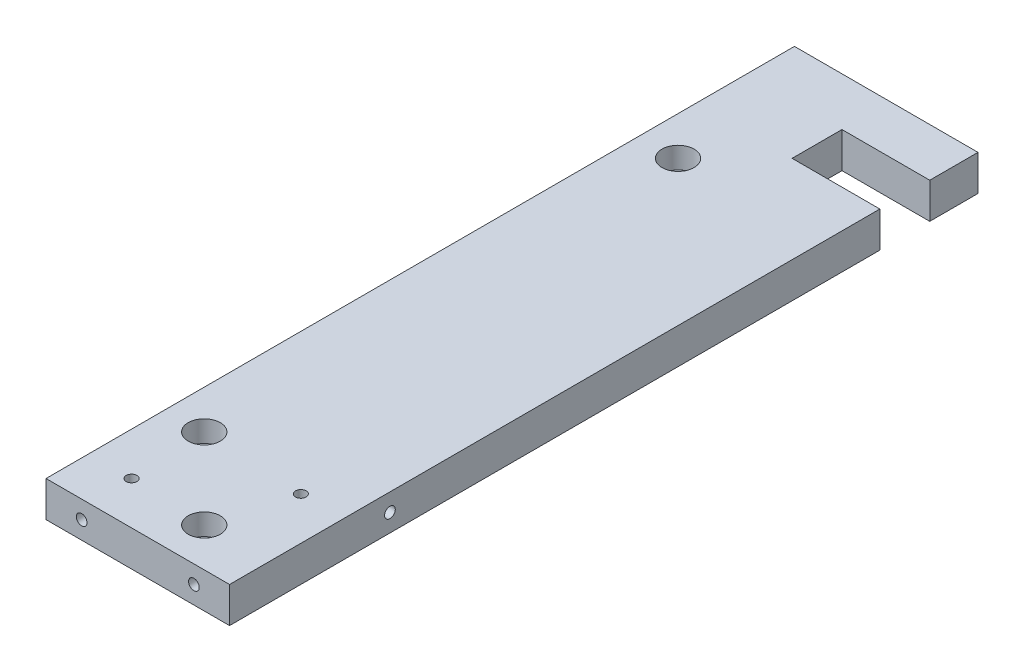
ISO-10303-21;
HEADER;
FILE_DESCRIPTION(('STEP AP214'),'2;1');
FILE_NAME('part.step','',(''),(''),'','','');
FILE_SCHEMA(('AUTOMOTIVE_DESIGN { 1 0 10303 214 1 1 1 1 }'));
ENDSEC;
DATA;
#1=APPLICATION_CONTEXT('core data for automotive mechanical design processes');
#2=APPLICATION_PROTOCOL_DEFINITION('international standard','automotive_design',2000,#1);
#3=PRODUCT_CONTEXT('',#1,'mechanical');
#4=PRODUCT('Part','Part','',(#3));
#5=PRODUCT_RELATED_PRODUCT_CATEGORY('part','',(#4));
#6=PRODUCT_DEFINITION_FORMATION('','',#4);
#7=PRODUCT_DEFINITION_CONTEXT('part definition',#1,'design');
#8=PRODUCT_DEFINITION('design','',#6,#7);
#9=PRODUCT_DEFINITION_SHAPE('','',#8);
#10=(LENGTH_UNIT() NAMED_UNIT(*) SI_UNIT(.MILLI.,.METRE.));
#11=(NAMED_UNIT(*) PLANE_ANGLE_UNIT() SI_UNIT($,.RADIAN.));
#12=(NAMED_UNIT(*) SI_UNIT($,.STERADIAN.) SOLID_ANGLE_UNIT());
#13=UNCERTAINTY_MEASURE_WITH_UNIT(LENGTH_MEASURE(1.E-05),#10,'distance_accuracy_value','');
#14=(GEOMETRIC_REPRESENTATION_CONTEXT(3) GLOBAL_UNCERTAINTY_ASSIGNED_CONTEXT((#13)) GLOBAL_UNIT_ASSIGNED_CONTEXT((#10,
#11,#12)) REPRESENTATION_CONTEXT('',''));
#15=CARTESIAN_POINT('',(0.,0.,0.));
#16=DIRECTION('',(0.,0.,1.));
#17=DIRECTION('',(1.,0.,0.));
#18=AXIS2_PLACEMENT_3D('',#15,#16,#17);
#19=CARTESIAN_POINT('',(-20.3137084989848,5.,-16.7637084989848));
#20=DIRECTION('',(0.,-1.,0.));
#21=DIRECTION('',(0.,0.,-1.));
#22=AXIS2_PLACEMENT_3D('',#19,#20,#21);
#23=CYLINDRICAL_SURFACE('',#22,1.5);
#24=CARTESIAN_POINT('',(-20.3137084989848,0.,-16.7637084989848));
#25=DIRECTION('',(0.,1.,0.));
#26=DIRECTION('',(0.,0.,1.));
#27=AXIS2_PLACEMENT_3D('',#24,#25,#26);
#28=CIRCLE('',#27,1.5);
#29=CARTESIAN_POINT('',(-20.3137084989848,0.,-15.2637084989848));
#30=VERTEX_POINT('',#29);
#31=EDGE_CURVE('E223',#30,#30,#28,.T.);
#32=ORIENTED_EDGE('',*,*,#31,.F.);
#33=EDGE_LOOP('',(#32));
#34=FACE_BOUND('',#33,.T.);
#35=CARTESIAN_POINT('',(-20.3137084989848,2.,-16.7637084989848));
#36=DIRECTION('',(0.,1.,0.));
#37=DIRECTION('',(0.,0.,1.));
#38=AXIS2_PLACEMENT_3D('',#35,#36,#37);
#39=CIRCLE('',#38,1.5);
#40=CARTESIAN_POINT('',(-20.3137084989848,2.,-15.2637084989848));
#41=VERTEX_POINT('',#40);
#42=EDGE_CURVE('E124',#41,#41,#39,.T.);
#43=ORIENTED_EDGE('',*,*,#42,.T.);
#44=EDGE_LOOP('',(#43));
#45=FACE_BOUND('',#44,.T.);
#46=ADVANCED_FACE('F120',(#34,#45),#23,.F.);
#47=CARTESIAN_POINT('',(-9.,5.,-5.45));
#48=DIRECTION('',(0.,-1.,0.));
#49=DIRECTION('',(0.,0.,-1.));
#50=AXIS2_PLACEMENT_3D('',#47,#48,#49);
#51=CYLINDRICAL_SURFACE('',#50,1.5);
#52=CARTESIAN_POINT('',(-9.,0.,-5.45));
#53=DIRECTION('',(0.,1.,0.));
#54=DIRECTION('',(0.,0.,1.));
#55=AXIS2_PLACEMENT_3D('',#52,#53,#54);
#56=CIRCLE('',#55,1.5);
#57=CARTESIAN_POINT('',(-9.,0.,-3.95));
#58=VERTEX_POINT('',#57);
#59=EDGE_CURVE('E260',#58,#58,#56,.T.);
#60=ORIENTED_EDGE('',*,*,#59,.F.);
#61=EDGE_LOOP('',(#60));
#62=FACE_BOUND('',#61,.T.);
#63=CARTESIAN_POINT('',(-9.,2.,-5.45));
#64=DIRECTION('',(0.,1.,0.));
#65=DIRECTION('',(0.,0.,1.));
#66=AXIS2_PLACEMENT_3D('',#63,#64,#65);
#67=CIRCLE('',#66,1.5);
#68=CARTESIAN_POINT('',(-9.,2.,-3.95));
#69=VERTEX_POINT('',#68);
#70=EDGE_CURVE('E250',#69,#69,#67,.T.);
#71=ORIENTED_EDGE('',*,*,#70,.T.);
#72=EDGE_LOOP('',(#71));
#73=FACE_BOUND('',#72,.T.);
#74=ADVANCED_FACE('F299',(#62,#73),#51,.F.);
#75=CARTESIAN_POINT('',(-20.3137084989848,5.,-83.2317459305205));
#76=DIRECTION('',(0.,-1.,0.));
#77=DIRECTION('',(0.,0.,-1.));
#78=AXIS2_PLACEMENT_3D('',#75,#76,#77);
#79=CYLINDRICAL_SURFACE('',#78,1.5);
#80=CARTESIAN_POINT('',(-20.3137084989848,0.,-83.2317459305205));
#81=DIRECTION('',(0.,1.,0.));
#82=DIRECTION('',(0.,0.,1.));
#83=AXIS2_PLACEMENT_3D('',#80,#81,#82);
#84=CIRCLE('',#83,1.5);
#85=CARTESIAN_POINT('',(-20.3137084989848,0.,-81.7317459305205));
#86=VERTEX_POINT('',#85);
#87=EDGE_CURVE('E256',#86,#86,#84,.T.);
#88=ORIENTED_EDGE('',*,*,#87,.F.);
#89=EDGE_LOOP('',(#88));
#90=FACE_BOUND('',#89,.T.);
#91=CARTESIAN_POINT('',(-20.3137084989848,2.,-83.2317459305205));
#92=DIRECTION('',(0.,1.,0.));
#93=DIRECTION('',(0.,0.,1.));
#94=AXIS2_PLACEMENT_3D('',#91,#92,#93);
#95=CIRCLE('',#94,1.5);
#96=CARTESIAN_POINT('',(-20.3137084989848,2.,-81.7317459305205));
#97=VERTEX_POINT('',#96);
#98=EDGE_CURVE('E248',#97,#97,#95,.T.);
#99=ORIENTED_EDGE('',*,*,#98,.T.);
#100=EDGE_LOOP('',(#99));
#101=FACE_BOUND('',#100,.T.);
#102=ADVANCED_FACE('F305',(#90,#101),#79,.F.);
#103=CARTESIAN_POINT('',(0.,5.,-98.2317459305205));
#104=DIRECTION('',(0.,0.,1.));
#105=DIRECTION('',(1.,0.,0.));
#106=AXIS2_PLACEMENT_3D('',#103,#104,#105);
#107=PLANE('',#106);
#108=DIRECTION('',(-1.,0.,0.));
#109=VECTOR('',#108,1.);
#110=CARTESIAN_POINT('',(0.,0.,-98.2317459305205));
#111=LINE('',#110,#109);
#112=CARTESIAN_POINT('',(0.,0.,-98.2317459305205));
#113=VERTEX_POINT('',#112);
#114=CARTESIAN_POINT('',(-12.3137084989848,0.,-98.2317459305205));
#115=VERTEX_POINT('',#114);
#116=EDGE_CURVE('E222',#113,#115,#111,.T.);
#117=ORIENTED_EDGE('',*,*,#116,.F.);
#118=DIRECTION('',(0.,-1.,0.));
#119=VECTOR('',#118,1.);
#120=CARTESIAN_POINT('',(0.,5.,-98.2317459305205));
#121=LINE('',#120,#119);
#122=CARTESIAN_POINT('',(0.,5.,-98.2317459305205));
#123=VERTEX_POINT('',#122);
#124=EDGE_CURVE('E130',#123,#113,#121,.T.);
#125=ORIENTED_EDGE('',*,*,#124,.F.);
#126=DIRECTION('',(-1.,0.,0.));
#127=VECTOR('',#126,1.);
#128=CARTESIAN_POINT('',(0.,5.,-98.2317459305205));
#129=LINE('',#128,#127);
#130=CARTESIAN_POINT('',(-12.3137084989848,5.,-98.2317459305205));
#131=VERTEX_POINT('',#130);
#132=EDGE_CURVE('E271',#123,#131,#129,.T.);
#133=ORIENTED_EDGE('',*,*,#132,.T.);
#134=DIRECTION('',(0.,-1.,0.));
#135=VECTOR('',#134,1.);
#136=CARTESIAN_POINT('',(-12.3137084989848,5.,-98.2317459305205));
#137=LINE('',#136,#135);
#138=EDGE_CURVE('E13',#131,#115,#137,.T.);
#139=ORIENTED_EDGE('',*,*,#138,.T.);
#140=EDGE_LOOP('',(#117,#125,#133,#139));
#141=FACE_BOUND('',#140,.T.);
#142=ADVANCED_FACE('F311',(#141),#107,.T.);
#143=CARTESIAN_POINT('',(0.,5.,0.));
#144=DIRECTION('',(-1.,0.,0.));
#145=DIRECTION('',(0.,0.,1.));
#146=AXIS2_PLACEMENT_3D('',#143,#144,#145);
#147=PLANE('',#146);
#148=DIRECTION('',(0.,0.,-1.));
#149=VECTOR('',#148,1.);
#150=CARTESIAN_POINT('',(0.,0.,0.));
#151=LINE('',#150,#149);
#152=CARTESIAN_POINT('',(0.,0.,-105.));
#153=VERTEX_POINT('',#152);
#154=EDGE_CURVE('E226',#113,#153,#151,.T.);
#155=ORIENTED_EDGE('',*,*,#154,.T.);
#156=DIRECTION('',(0.,-1.,0.));
#157=VECTOR('',#156,1.);
#158=CARTESIAN_POINT('',(0.,5.,-105.));
#159=LINE('',#158,#157);
#160=CARTESIAN_POINT('',(0.,5.,-105.));
#161=VERTEX_POINT('',#160);
#162=EDGE_CURVE('E244',#161,#153,#159,.T.);
#163=ORIENTED_EDGE('',*,*,#162,.F.);
#164=DIRECTION('',(0.,0.,-1.));
#165=VECTOR('',#164,1.);
#166=CARTESIAN_POINT('',(0.,5.,0.));
#167=LINE('',#166,#165);
#168=EDGE_CURVE('E209',#123,#161,#167,.T.);
#169=ORIENTED_EDGE('',*,*,#168,.F.);
#170=ORIENTED_EDGE('',*,*,#124,.T.);
#171=EDGE_LOOP('',(#155,#163,#169,#170));
#172=FACE_BOUND('',#171,.T.);
#173=ADVANCED_FACE('F514',(#172),#147,.F.);
#174=CARTESIAN_POINT('',(0.,5.,-105.));
#175=DIRECTION('',(0.,0.,1.));
#176=DIRECTION('',(1.,0.,0.));
#177=AXIS2_PLACEMENT_3D('',#174,#175,#176);
#178=PLANE('',#177);
#179=DIRECTION('',(-1.,0.,0.));
#180=VECTOR('',#179,1.);
#181=CARTESIAN_POINT('',(0.,0.,-105.));
#182=LINE('',#181,#180);
#183=CARTESIAN_POINT('',(-25.75,0.,-105.));
#184=VERTEX_POINT('',#183);
#185=EDGE_CURVE('E229',#153,#184,#182,.T.);
#186=ORIENTED_EDGE('',*,*,#185,.T.);
#187=DIRECTION('',(0.,-1.,0.));
#188=VECTOR('',#187,1.);
#189=CARTESIAN_POINT('',(-25.75,5.,-105.));
#190=LINE('',#189,#188);
#191=CARTESIAN_POINT('',(-25.75,5.,-105.));
#192=VERTEX_POINT('',#191);
#193=EDGE_CURVE('E242',#192,#184,#190,.T.);
#194=ORIENTED_EDGE('',*,*,#193,.F.);
#195=DIRECTION('',(-1.,0.,0.));
#196=VECTOR('',#195,1.);
#197=CARTESIAN_POINT('',(0.,5.,-105.));
#198=LINE('',#197,#196);
#199=EDGE_CURVE('E215',#161,#192,#198,.T.);
#200=ORIENTED_EDGE('',*,*,#199,.F.);
#201=ORIENTED_EDGE('',*,*,#162,.T.);
#202=EDGE_LOOP('',(#186,#194,#200,#201));
#203=FACE_BOUND('',#202,.T.);
#204=ADVANCED_FACE('F279',(#203),#178,.F.);
#205=CARTESIAN_POINT('',(-25.75,5.,0.));
#206=DIRECTION('',(-1.,0.,0.));
#207=DIRECTION('',(0.,0.,1.));
#208=AXIS2_PLACEMENT_3D('',#205,#206,#207);
#209=PLANE('',#208);
#210=CARTESIAN_POINT('',(-25.75,2.5,-10.));
#211=DIRECTION('',(-1.,0.,0.));
#212=DIRECTION('',(0.,0.,1.));
#213=AXIS2_PLACEMENT_3D('',#210,#211,#212);
#214=CIRCLE('',#213,0.75);
#215=CARTESIAN_POINT('',(-25.75,2.5,-9.25));
#216=VERTEX_POINT('',#215);
#217=EDGE_CURVE('E414',#216,#216,#214,.T.);
#218=ORIENTED_EDGE('',*,*,#217,.F.);
#219=EDGE_LOOP('',(#218));
#220=FACE_BOUND('',#219,.T.);
#221=CARTESIAN_POINT('',(-25.75,2.5,-30.));
#222=DIRECTION('',(-1.,0.,0.));
#223=DIRECTION('',(0.,0.,1.));
#224=AXIS2_PLACEMENT_3D('',#221,#222,#223);
#225=CIRCLE('',#224,0.749999999999998);
#226=CARTESIAN_POINT('',(-25.75,2.5,-29.25));
#227=VERTEX_POINT('',#226);
#228=EDGE_CURVE('E420',#227,#227,#225,.T.);
#229=ORIENTED_EDGE('',*,*,#228,.F.);
#230=EDGE_LOOP('',(#229));
#231=FACE_BOUND('',#230,.T.);
#232=CARTESIAN_POINT('',(-25.75,2.5,-50.));
#233=DIRECTION('',(-1.,0.,0.));
#234=DIRECTION('',(0.,0.,1.));
#235=AXIS2_PLACEMENT_3D('',#232,#233,#234);
#236=CIRCLE('',#235,0.749999999999999);
#237=CARTESIAN_POINT('',(-25.75,2.5,-49.25));
#238=VERTEX_POINT('',#237);
#239=EDGE_CURVE('E428',#238,#238,#236,.T.);
#240=ORIENTED_EDGE('',*,*,#239,.F.);
#241=EDGE_LOOP('',(#240));
#242=FACE_BOUND('',#241,.T.);
#243=CARTESIAN_POINT('',(-25.75,2.5,-70.));
#244=DIRECTION('',(-1.,0.,0.));
#245=DIRECTION('',(0.,0.,1.));
#246=AXIS2_PLACEMENT_3D('',#243,#244,#245);
#247=CIRCLE('',#246,0.749999999999999);
#248=CARTESIAN_POINT('',(-25.75,2.5,-69.25));
#249=VERTEX_POINT('',#248);
#250=EDGE_CURVE('E434',#249,#249,#247,.T.);
#251=ORIENTED_EDGE('',*,*,#250,.F.);
#252=EDGE_LOOP('',(#251));
#253=FACE_BOUND('',#252,.T.);
#254=CARTESIAN_POINT('',(-25.75,2.5,-90.));
#255=DIRECTION('',(-1.,0.,0.));
#256=DIRECTION('',(0.,0.,1.));
#257=AXIS2_PLACEMENT_3D('',#254,#255,#256);
#258=CIRCLE('',#257,0.749999999999999);
#259=CARTESIAN_POINT('',(-25.75,2.5,-89.25));
#260=VERTEX_POINT('',#259);
#261=EDGE_CURVE('E440',#260,#260,#258,.T.);
#262=ORIENTED_EDGE('',*,*,#261,.F.);
#263=EDGE_LOOP('',(#262));
#264=FACE_BOUND('',#263,.T.);
#265=DIRECTION('',(0.,0.,-1.));
#266=VECTOR('',#265,1.);
#267=CARTESIAN_POINT('',(-25.75,0.,0.));
#268=LINE('',#267,#266);
#269=CARTESIAN_POINT('',(-25.75,0.,0.));
#270=VERTEX_POINT('',#269);
#271=EDGE_CURVE('E233',#270,#184,#268,.T.);
#272=ORIENTED_EDGE('',*,*,#271,.F.);
#273=DIRECTION('',(0.,-1.,0.));
#274=VECTOR('',#273,1.);
#275=CARTESIAN_POINT('',(-25.75,5.,0.));
#276=LINE('',#275,#274);
#277=CARTESIAN_POINT('',(-25.75,5.,0.));
#278=VERTEX_POINT('',#277);
#279=EDGE_CURVE('E202',#278,#270,#276,.T.);
#280=ORIENTED_EDGE('',*,*,#279,.F.);
#281=DIRECTION('',(0.,0.,-1.));
#282=VECTOR('',#281,1.);
#283=CARTESIAN_POINT('',(-25.75,5.,0.));
#284=LINE('',#283,#282);
#285=EDGE_CURVE('E213',#278,#192,#284,.T.);
#286=ORIENTED_EDGE('',*,*,#285,.T.);
#287=ORIENTED_EDGE('',*,*,#193,.T.);
#288=EDGE_LOOP('',(#272,#280,#286,#287));
#289=FACE_BOUND('',#288,.T.);
#290=ADVANCED_FACE('F282',(#220,#231,#242,#253,#264,#289),#209,.T.);
#291=CARTESIAN_POINT('',(0.,5.,0.));
#292=DIRECTION('',(0.,0.,1.));
#293=DIRECTION('',(1.,0.,0.));
#294=AXIS2_PLACEMENT_3D('',#291,#292,#293);
#295=PLANE('',#294);
#296=CARTESIAN_POINT('',(-20.75,2.5,0.));
#297=DIRECTION('',(0.,0.,1.));
#298=DIRECTION('',(1.,0.,0.));
#299=AXIS2_PLACEMENT_3D('',#296,#297,#298);
#300=CIRCLE('',#299,0.750000000000002);
#301=CARTESIAN_POINT('',(-20.,2.5,0.));
#302=VERTEX_POINT('',#301);
#303=EDGE_CURVE('E464',#302,#302,#300,.T.);
#304=ORIENTED_EDGE('',*,*,#303,.F.);
#305=EDGE_LOOP('',(#304));
#306=FACE_BOUND('',#305,.T.);
#307=CARTESIAN_POINT('',(-5.,2.5,0.));
#308=DIRECTION('',(0.,0.,1.));
#309=DIRECTION('',(1.,0.,0.));
#310=AXIS2_PLACEMENT_3D('',#307,#308,#309);
#311=CIRCLE('',#310,0.749999999999999);
#312=CARTESIAN_POINT('',(-4.25,2.5,0.));
#313=VERTEX_POINT('',#312);
#314=EDGE_CURVE('E467',#313,#313,#311,.T.);
#315=ORIENTED_EDGE('',*,*,#314,.F.);
#316=EDGE_LOOP('',(#315));
#317=FACE_BOUND('',#316,.T.);
#318=DIRECTION('',(-1.,0.,0.));
#319=VECTOR('',#318,1.);
#320=CARTESIAN_POINT('',(0.,0.,0.));
#321=LINE('',#320,#319);
#322=CARTESIAN_POINT('',(0.,0.,0.));
#323=VERTEX_POINT('',#322);
#324=EDGE_CURVE('E199',#323,#270,#321,.T.);
#325=ORIENTED_EDGE('',*,*,#324,.F.);
#326=DIRECTION('',(0.,-1.,0.));
#327=VECTOR('',#326,1.);
#328=CARTESIAN_POINT('',(0.,5.,0.));
#329=LINE('',#328,#327);
#330=CARTESIAN_POINT('',(0.,5.,0.));
#331=VERTEX_POINT('',#330);
#332=EDGE_CURVE('E193',#331,#323,#329,.T.);
#333=ORIENTED_EDGE('',*,*,#332,.F.);
#334=DIRECTION('',(-1.,0.,0.));
#335=VECTOR('',#334,1.);
#336=CARTESIAN_POINT('',(0.,5.,0.));
#337=LINE('',#336,#335);
#338=EDGE_CURVE('E197',#331,#278,#337,.T.);
#339=ORIENTED_EDGE('',*,*,#338,.T.);
#340=ORIENTED_EDGE('',*,*,#279,.T.);
#341=EDGE_LOOP('',(#325,#333,#339,#340));
#342=FACE_BOUND('',#341,.T.);
#343=ADVANCED_FACE('F195',(#306,#317,#342),#295,.T.);
#344=CARTESIAN_POINT('',(0.,2.5,-22.5));
#345=DIRECTION('',(1.,0.,0.));
#346=DIRECTION('',(0.,0.,-1.));
#347=AXIS2_PLACEMENT_3D('',#344,#345,#346);
#348=CIRCLE('',#347,0.750000000000002);
#349=CARTESIAN_POINT('',(0.,2.5,-23.25));
#350=VERTEX_POINT('',#349);
#351=EDGE_CURVE('E448',#350,#350,#348,.T.);
#352=ORIENTED_EDGE('',*,*,#351,.F.);
#353=EDGE_LOOP('',(#352));
#354=FACE_BOUND('',#353,.T.);
#355=CARTESIAN_POINT('',(0.,0.,-91.2317459305205));
#356=VERTEX_POINT('',#355);
#357=EDGE_CURVE('E230',#323,#356,#151,.T.);
#358=ORIENTED_EDGE('',*,*,#357,.T.);
#359=DIRECTION('',(0.,-1.,0.));
#360=VECTOR('',#359,1.);
#361=CARTESIAN_POINT('',(0.,5.,-91.2317459305205));
#362=LINE('',#361,#360);
#363=CARTESIAN_POINT('',(0.,5.,-91.2317459305205));
#364=VERTEX_POINT('',#363);
#365=EDGE_CURVE('E203',#364,#356,#362,.T.);
#366=ORIENTED_EDGE('',*,*,#365,.F.);
#367=EDGE_CURVE('E206',#331,#364,#167,.T.);
#368=ORIENTED_EDGE('',*,*,#367,.F.);
#369=ORIENTED_EDGE('',*,*,#332,.T.);
#370=EDGE_LOOP('',(#358,#366,#368,#369));
#371=FACE_BOUND('',#370,.T.);
#372=ADVANCED_FACE('F207',(#354,#371),#147,.F.);
#373=CARTESIAN_POINT('',(0.,5.,-91.2317459305205));
#374=DIRECTION('',(0.,0.,1.));
#375=DIRECTION('',(1.,0.,0.));
#376=AXIS2_PLACEMENT_3D('',#373,#374,#375);
#377=PLANE('',#376);
#378=DIRECTION('',(-1.,0.,0.));
#379=VECTOR('',#378,1.);
#380=CARTESIAN_POINT('',(0.,0.,-91.2317459305205));
#381=LINE('',#380,#379);
#382=CARTESIAN_POINT('',(-12.3137084989848,0.,-91.2317459305205));
#383=VERTEX_POINT('',#382);
#384=EDGE_CURVE('E167',#356,#383,#381,.T.);
#385=ORIENTED_EDGE('',*,*,#384,.T.);
#386=DIRECTION('',(0.,-1.,0.));
#387=VECTOR('',#386,1.);
#388=CARTESIAN_POINT('',(-12.3137084989848,5.,-91.2317459305205));
#389=LINE('',#388,#387);
#390=CARTESIAN_POINT('',(-12.3137084989848,5.,-91.2317459305205));
#391=VERTEX_POINT('',#390);
#392=EDGE_CURVE('E174',#391,#383,#389,.T.);
#393=ORIENTED_EDGE('',*,*,#392,.F.);
#394=DIRECTION('',(-1.,0.,0.));
#395=VECTOR('',#394,1.);
#396=CARTESIAN_POINT('',(0.,5.,-91.2317459305205));
#397=LINE('',#396,#395);
#398=EDGE_CURVE('E139',#364,#391,#397,.T.);
#399=ORIENTED_EDGE('',*,*,#398,.F.);
#400=ORIENTED_EDGE('',*,*,#365,.T.);
#401=EDGE_LOOP('',(#385,#393,#399,#400));
#402=FACE_BOUND('',#401,.T.);
#403=ADVANCED_FACE('F294',(#402),#377,.F.);
#404=CARTESIAN_POINT('',(-12.3137084989848,5.,0.));
#405=DIRECTION('',(1.,0.,0.));
#406=DIRECTION('',(0.,0.,-1.));
#407=AXIS2_PLACEMENT_3D('',#404,#405,#406);
#408=PLANE('',#407);
#409=DIRECTION('',(0.,0.,1.));
#410=VECTOR('',#409,1.);
#411=CARTESIAN_POINT('',(-12.3137084989848,0.,0.));
#412=LINE('',#411,#410);
#413=EDGE_CURVE('E220',#115,#383,#412,.T.);
#414=ORIENTED_EDGE('',*,*,#413,.F.);
#415=ORIENTED_EDGE('',*,*,#138,.F.);
#416=DIRECTION('',(0.,0.,1.));
#417=VECTOR('',#416,1.);
#418=CARTESIAN_POINT('',(-12.3137084989848,5.,0.));
#419=LINE('',#418,#417);
#420=EDGE_CURVE('E238',#131,#391,#419,.T.);
#421=ORIENTED_EDGE('',*,*,#420,.T.);
#422=ORIENTED_EDGE('',*,*,#392,.T.);
#423=EDGE_LOOP('',(#414,#415,#421,#422));
#424=FACE_BOUND('',#423,.T.);
#425=ADVANCED_FACE('F122',(#424),#408,.T.);
#426=CARTESIAN_POINT('',(0.,0.,0.));
#427=DIRECTION('',(0.,1.,0.));
#428=DIRECTION('',(0.,0.,1.));
#429=AXIS2_PLACEMENT_3D('',#426,#427,#428);
#430=PLANE('',#429);
#431=CARTESIAN_POINT('',(-19.75,0.,-6.));
#432=DIRECTION('',(0.,1.,0.));
#433=DIRECTION('',(0.,0.,1.));
#434=AXIS2_PLACEMENT_3D('',#431,#432,#433);
#435=CIRCLE('',#434,0.750000000000002);
#436=CARTESIAN_POINT('',(-19.75,0.,-5.25));
#437=VERTEX_POINT('',#436);
#438=EDGE_CURVE('E446',#437,#437,#435,.T.);
#439=ORIENTED_EDGE('',*,*,#438,.T.);
#440=EDGE_LOOP('',(#439));
#441=FACE_BOUND('',#440,.T.);
#442=CARTESIAN_POINT('',(-6.,0.,-16.));
#443=DIRECTION('',(0.,1.,0.));
#444=DIRECTION('',(0.,0.,1.));
#445=AXIS2_PLACEMENT_3D('',#442,#443,#444);
#446=CIRCLE('',#445,0.75);
#447=CARTESIAN_POINT('',(-6.,0.,-15.25));
#448=VERTEX_POINT('',#447);
#449=EDGE_CURVE('E413',#448,#448,#446,.T.);
#450=ORIENTED_EDGE('',*,*,#449,.T.);
#451=EDGE_LOOP('',(#450));
#452=FACE_BOUND('',#451,.T.);
#453=ORIENTED_EDGE('',*,*,#87,.T.);
#454=EDGE_LOOP('',(#453));
#455=FACE_BOUND('',#454,.T.);
#456=ORIENTED_EDGE('',*,*,#59,.T.);
#457=EDGE_LOOP('',(#456));
#458=FACE_BOUND('',#457,.T.);
#459=ORIENTED_EDGE('',*,*,#31,.T.);
#460=EDGE_LOOP('',(#459));
#461=FACE_BOUND('',#460,.T.);
#462=ORIENTED_EDGE('',*,*,#413,.T.);
#463=ORIENTED_EDGE('',*,*,#384,.F.);
#464=ORIENTED_EDGE('',*,*,#357,.F.);
#465=ORIENTED_EDGE('',*,*,#324,.T.);
#466=ORIENTED_EDGE('',*,*,#271,.T.);
#467=ORIENTED_EDGE('',*,*,#185,.F.);
#468=ORIENTED_EDGE('',*,*,#154,.F.);
#469=ORIENTED_EDGE('',*,*,#116,.T.);
#470=EDGE_LOOP('',(#462,#463,#464,#465,#466,#467,#468,#469));
#471=FACE_BOUND('',#470,.T.);
#472=ADVANCED_FACE('F283',(#441,#452,#455,#458,#461,#471),#430,.F.);
#473=CARTESIAN_POINT('',(0.,5.,0.));
#474=DIRECTION('',(0.,1.,0.));
#475=DIRECTION('',(0.,0.,1.));
#476=AXIS2_PLACEMENT_3D('',#473,#474,#475);
#477=PLANE('',#476);
#478=CARTESIAN_POINT('',(-19.75,5.,-6.));
#479=DIRECTION('',(0.,1.,0.));
#480=DIRECTION('',(0.,0.,1.));
#481=AXIS2_PLACEMENT_3D('',#478,#479,#480);
#482=CIRCLE('',#481,0.750000000000002);
#483=CARTESIAN_POINT('',(-19.75,5.,-5.25));
#484=VERTEX_POINT('',#483);
#485=EDGE_CURVE('E449',#484,#484,#482,.T.);
#486=ORIENTED_EDGE('',*,*,#485,.F.);
#487=EDGE_LOOP('',(#486));
#488=FACE_BOUND('',#487,.T.);
#489=CARTESIAN_POINT('',(-6.,5.,-16.));
#490=DIRECTION('',(0.,1.,0.));
#491=DIRECTION('',(0.,0.,1.));
#492=AXIS2_PLACEMENT_3D('',#489,#490,#491);
#493=CIRCLE('',#492,0.75);
#494=CARTESIAN_POINT('',(-6.,5.,-15.25));
#495=VERTEX_POINT('',#494);
#496=EDGE_CURVE('E417',#495,#495,#493,.T.);
#497=ORIENTED_EDGE('',*,*,#496,.F.);
#498=EDGE_LOOP('',(#497));
#499=FACE_BOUND('',#498,.T.);
#500=CARTESIAN_POINT('',(-20.3137084989848,5.,-83.2317459305205));
#501=DIRECTION('',(0.,1.,0.));
#502=DIRECTION('',(0.,0.,1.));
#503=AXIS2_PLACEMENT_3D('',#500,#501,#502);
#504=CIRCLE('',#503,2.25);
#505=CARTESIAN_POINT('',(-20.3137084989848,5.,-80.9817459305205));
#506=VERTEX_POINT('',#505);
#507=EDGE_CURVE('E472',#506,#506,#504,.T.);
#508=ORIENTED_EDGE('',*,*,#507,.F.);
#509=EDGE_LOOP('',(#508));
#510=FACE_BOUND('',#509,.T.);
#511=CARTESIAN_POINT('',(-20.3137084989848,5.,-16.7637084989848));
#512=DIRECTION('',(0.,1.,0.));
#513=DIRECTION('',(0.,0.,1.));
#514=AXIS2_PLACEMENT_3D('',#511,#512,#513);
#515=CIRCLE('',#514,2.25);
#516=CARTESIAN_POINT('',(-20.3137084989848,5.,-14.5137084989848));
#517=VERTEX_POINT('',#516);
#518=EDGE_CURVE('E475',#517,#517,#515,.T.);
#519=ORIENTED_EDGE('',*,*,#518,.F.);
#520=EDGE_LOOP('',(#519));
#521=FACE_BOUND('',#520,.T.);
#522=CARTESIAN_POINT('',(-9.,5.,-5.45));
#523=DIRECTION('',(0.,1.,0.));
#524=DIRECTION('',(0.,0.,1.));
#525=AXIS2_PLACEMENT_3D('',#522,#523,#524);
#526=CIRCLE('',#525,2.25);
#527=CARTESIAN_POINT('',(-9.,5.,-3.2));
#528=VERTEX_POINT('',#527);
#529=EDGE_CURVE('E481',#528,#528,#526,.T.);
#530=ORIENTED_EDGE('',*,*,#529,.F.);
#531=EDGE_LOOP('',(#530));
#532=FACE_BOUND('',#531,.T.);
#533=ORIENTED_EDGE('',*,*,#420,.F.);
#534=ORIENTED_EDGE('',*,*,#132,.F.);
#535=ORIENTED_EDGE('',*,*,#168,.T.);
#536=ORIENTED_EDGE('',*,*,#199,.T.);
#537=ORIENTED_EDGE('',*,*,#285,.F.);
#538=ORIENTED_EDGE('',*,*,#338,.F.);
#539=ORIENTED_EDGE('',*,*,#367,.T.);
#540=ORIENTED_EDGE('',*,*,#398,.T.);
#541=EDGE_LOOP('',(#533,#534,#535,#536,#537,#538,#539,#540));
#542=FACE_BOUND('',#541,.T.);
#543=ADVANCED_FACE('F211',(#488,#499,#510,#521,#532,#542),#477,.T.);
#544=CARTESIAN_POINT('',(-20.3137084989848,-6.36396103067892,-83.2317459305205));
#545=DIRECTION('',(0.,1.,0.));
#546=DIRECTION('',(0.,0.,1.));
#547=AXIS2_PLACEMENT_3D('',#544,#545,#546);
#548=CYLINDRICAL_SURFACE('',#547,2.25);
#549=CARTESIAN_POINT('',(-20.3137084989848,2.,-83.2317459305205));
#550=DIRECTION('',(0.,1.,0.));
#551=DIRECTION('',(0.,0.,1.));
#552=AXIS2_PLACEMENT_3D('',#549,#550,#551);
#553=CIRCLE('',#552,2.25);
#554=CARTESIAN_POINT('',(-20.3137084989848,2.,-80.9817459305205));
#555=VERTEX_POINT('',#554);
#556=EDGE_CURVE('E251',#555,#555,#553,.F.);
#557=ORIENTED_EDGE('',*,*,#556,.T.);
#558=EDGE_LOOP('',(#557));
#559=FACE_BOUND('',#558,.T.);
#560=ORIENTED_EDGE('',*,*,#507,.T.);
#561=EDGE_LOOP('',(#560));
#562=FACE_BOUND('',#561,.T.);
#563=ADVANCED_FACE('F291',(#559,#562),#548,.F.);
#564=CARTESIAN_POINT('',(0.,2.,0.));
#565=DIRECTION('',(0.,1.,0.));
#566=DIRECTION('',(0.,0.,1.));
#567=AXIS2_PLACEMENT_3D('',#564,#565,#566);
#568=PLANE('',#567);
#569=ORIENTED_EDGE('',*,*,#98,.F.);
#570=EDGE_LOOP('',(#569));
#571=FACE_BOUND('',#570,.T.);
#572=ORIENTED_EDGE('',*,*,#556,.F.);
#573=EDGE_LOOP('',(#572));
#574=FACE_BOUND('',#573,.T.);
#575=ADVANCED_FACE('F322',(#571,#574),#568,.T.);
#576=CARTESIAN_POINT('',(-9.,-6.36396103067892,-5.45));
#577=DIRECTION('',(0.,1.,0.));
#578=DIRECTION('',(0.,0.,1.));
#579=AXIS2_PLACEMENT_3D('',#576,#577,#578);
#580=CYLINDRICAL_SURFACE('',#579,2.25);
#581=CARTESIAN_POINT('',(-9.,2.,-5.45));
#582=DIRECTION('',(0.,1.,0.));
#583=DIRECTION('',(0.,0.,1.));
#584=AXIS2_PLACEMENT_3D('',#581,#582,#583);
#585=CIRCLE('',#584,2.25);
#586=CARTESIAN_POINT('',(-9.,2.,-3.2));
#587=VERTEX_POINT('',#586);
#588=EDGE_CURVE('E463',#587,#587,#585,.F.);
#589=ORIENTED_EDGE('',*,*,#588,.T.);
#590=EDGE_LOOP('',(#589));
#591=FACE_BOUND('',#590,.T.);
#592=ORIENTED_EDGE('',*,*,#529,.T.);
#593=EDGE_LOOP('',(#592));
#594=FACE_BOUND('',#593,.T.);
#595=ADVANCED_FACE('F318',(#591,#594),#580,.F.);
#596=CARTESIAN_POINT('',(0.,2.,0.));
#597=DIRECTION('',(0.,1.,0.));
#598=DIRECTION('',(0.,0.,1.));
#599=AXIS2_PLACEMENT_3D('',#596,#597,#598);
#600=PLANE('',#599);
#601=ORIENTED_EDGE('',*,*,#70,.F.);
#602=EDGE_LOOP('',(#601));
#603=FACE_BOUND('',#602,.T.);
#604=ORIENTED_EDGE('',*,*,#588,.F.);
#605=EDGE_LOOP('',(#604));
#606=FACE_BOUND('',#605,.T.);
#607=ADVANCED_FACE('F314',(#603,#606),#600,.T.);
#608=CARTESIAN_POINT('',(-20.3137084989848,-6.36396103067892,-16.7637084989848));
#609=DIRECTION('',(0.,1.,0.));
#610=DIRECTION('',(0.,0.,1.));
#611=AXIS2_PLACEMENT_3D('',#608,#609,#610);
#612=CYLINDRICAL_SURFACE('',#611,2.25);
#613=CARTESIAN_POINT('',(-20.3137084989848,2.,-16.7637084989848));
#614=DIRECTION('',(0.,1.,0.));
#615=DIRECTION('',(0.,0.,1.));
#616=AXIS2_PLACEMENT_3D('',#613,#614,#615);
#617=CIRCLE('',#616,2.25);
#618=CARTESIAN_POINT('',(-20.3137084989848,2.,-14.5137084989848));
#619=VERTEX_POINT('',#618);
#620=EDGE_CURVE('E478',#619,#619,#617,.F.);
#621=ORIENTED_EDGE('',*,*,#620,.T.);
#622=EDGE_LOOP('',(#621));
#623=FACE_BOUND('',#622,.T.);
#624=ORIENTED_EDGE('',*,*,#518,.T.);
#625=EDGE_LOOP('',(#624));
#626=FACE_BOUND('',#625,.T.);
#627=ADVANCED_FACE('F317',(#623,#626),#612,.F.);
#628=CARTESIAN_POINT('',(0.,2.,0.));
#629=DIRECTION('',(0.,1.,0.));
#630=DIRECTION('',(0.,0.,1.));
#631=AXIS2_PLACEMENT_3D('',#628,#629,#630);
#632=PLANE('',#631);
#633=ORIENTED_EDGE('',*,*,#42,.F.);
#634=EDGE_LOOP('',(#633));
#635=FACE_BOUND('',#634,.T.);
#636=ORIENTED_EDGE('',*,*,#620,.F.);
#637=EDGE_LOOP('',(#636));
#638=FACE_BOUND('',#637,.T.);
#639=ADVANCED_FACE('F324',(#635,#638),#632,.T.);
#640=CARTESIAN_POINT('',(-5.,2.5,-2.));
#641=DIRECTION('',(0.,0.,1.));
#642=DIRECTION('',(1.,0.,0.));
#643=AXIS2_PLACEMENT_3D('',#640,#641,#642);
#644=CYLINDRICAL_SURFACE('',#643,0.749999999999999);
#645=CARTESIAN_POINT('',(-5.,2.5,-2.));
#646=DIRECTION('',(0.,0.,1.));
#647=DIRECTION('',(1.,0.,0.));
#648=AXIS2_PLACEMENT_3D('',#645,#646,#647);
#649=CIRCLE('',#648,0.749999999999999);
#650=CARTESIAN_POINT('',(-4.25,2.5,-2.));
#651=VERTEX_POINT('',#650);
#652=EDGE_CURVE('E457',#651,#651,#649,.T.);
#653=ORIENTED_EDGE('',*,*,#652,.F.);
#654=EDGE_LOOP('',(#653));
#655=FACE_BOUND('',#654,.T.);
#656=ORIENTED_EDGE('',*,*,#314,.T.);
#657=EDGE_LOOP('',(#656));
#658=FACE_BOUND('',#657,.T.);
#659=ADVANCED_FACE('F327',(#655,#658),#644,.F.);
#660=CARTESIAN_POINT('',(-5.,2.5,-2.));
#661=DIRECTION('',(0.,0.,1.));
#662=DIRECTION('',(1.,0.,0.));
#663=AXIS2_PLACEMENT_3D('',#660,#661,#662);
#664=PLANE('',#663);
#665=ORIENTED_EDGE('',*,*,#652,.T.);
#666=EDGE_LOOP('',(#665));
#667=FACE_BOUND('',#666,.T.);
#668=ADVANCED_FACE('F338',(#667),#664,.T.);
#669=CARTESIAN_POINT('',(-20.75,2.5,-2.));
#670=DIRECTION('',(0.,0.,1.));
#671=DIRECTION('',(1.,0.,0.));
#672=AXIS2_PLACEMENT_3D('',#669,#670,#671);
#673=CYLINDRICAL_SURFACE('',#672,0.750000000000002);
#674=CARTESIAN_POINT('',(-20.75,2.5,-2.));
#675=DIRECTION('',(0.,0.,1.));
#676=DIRECTION('',(1.,0.,0.));
#677=AXIS2_PLACEMENT_3D('',#674,#675,#676);
#678=CIRCLE('',#677,0.750000000000002);
#679=CARTESIAN_POINT('',(-20.,2.5,-2.));
#680=VERTEX_POINT('',#679);
#681=EDGE_CURVE('E460',#680,#680,#678,.T.);
#682=ORIENTED_EDGE('',*,*,#681,.F.);
#683=EDGE_LOOP('',(#682));
#684=FACE_BOUND('',#683,.T.);
#685=ORIENTED_EDGE('',*,*,#303,.T.);
#686=EDGE_LOOP('',(#685));
#687=FACE_BOUND('',#686,.T.);
#688=ADVANCED_FACE('F341',(#684,#687),#673,.F.);
#689=CARTESIAN_POINT('',(-20.75,2.5,-2.));
#690=DIRECTION('',(0.,0.,1.));
#691=DIRECTION('',(1.,0.,0.));
#692=AXIS2_PLACEMENT_3D('',#689,#690,#691);
#693=PLANE('',#692);
#694=ORIENTED_EDGE('',*,*,#681,.T.);
#695=EDGE_LOOP('',(#694));
#696=FACE_BOUND('',#695,.T.);
#697=ADVANCED_FACE('F348',(#696),#693,.T.);
#698=CARTESIAN_POINT('',(-2.,2.5,-22.5));
#699=DIRECTION('',(1.,0.,0.));
#700=DIRECTION('',(0.,0.,-1.));
#701=AXIS2_PLACEMENT_3D('',#698,#699,#700);
#702=CYLINDRICAL_SURFACE('',#701,0.750000000000002);
#703=CARTESIAN_POINT('',(-2.,2.5,-22.5));
#704=DIRECTION('',(1.,0.,0.));
#705=DIRECTION('',(0.,0.,-1.));
#706=AXIS2_PLACEMENT_3D('',#703,#704,#705);
#707=CIRCLE('',#706,0.750000000000002);
#708=CARTESIAN_POINT('',(-2.,2.5,-23.25));
#709=VERTEX_POINT('',#708);
#710=EDGE_CURVE('E454',#709,#709,#707,.T.);
#711=ORIENTED_EDGE('',*,*,#710,.F.);
#712=EDGE_LOOP('',(#711));
#713=FACE_BOUND('',#712,.T.);
#714=ORIENTED_EDGE('',*,*,#351,.T.);
#715=EDGE_LOOP('',(#714));
#716=FACE_BOUND('',#715,.T.);
#717=ADVANCED_FACE('F352',(#713,#716),#702,.F.);
#718=CARTESIAN_POINT('',(-2.,2.5,-22.5));
#719=DIRECTION('',(1.,0.,0.));
#720=DIRECTION('',(0.,0.,-1.));
#721=AXIS2_PLACEMENT_3D('',#718,#719,#720);
#722=PLANE('',#721);
#723=ORIENTED_EDGE('',*,*,#710,.T.);
#724=EDGE_LOOP('',(#723));
#725=FACE_BOUND('',#724,.T.);
#726=ADVANCED_FACE('F356',(#725),#722,.T.);
#727=CARTESIAN_POINT('',(-6.,0.,-16.));
#728=DIRECTION('',(0.,1.,0.));
#729=DIRECTION('',(0.,0.,1.));
#730=AXIS2_PLACEMENT_3D('',#727,#728,#729);
#731=CYLINDRICAL_SURFACE('',#730,0.75);
#732=ORIENTED_EDGE('',*,*,#449,.F.);
#733=EDGE_LOOP('',(#732));
#734=FACE_BOUND('',#733,.T.);
#735=ORIENTED_EDGE('',*,*,#496,.T.);
#736=EDGE_LOOP('',(#735));
#737=FACE_BOUND('',#736,.T.);
#738=ADVANCED_FACE('F360',(#734,#737),#731,.F.);
#739=CARTESIAN_POINT('',(-19.75,0.,-6.));
#740=DIRECTION('',(0.,1.,0.));
#741=DIRECTION('',(0.,0.,1.));
#742=AXIS2_PLACEMENT_3D('',#739,#740,#741);
#743=CYLINDRICAL_SURFACE('',#742,0.750000000000002);
#744=ORIENTED_EDGE('',*,*,#438,.F.);
#745=EDGE_LOOP('',(#744));
#746=FACE_BOUND('',#745,.T.);
#747=ORIENTED_EDGE('',*,*,#485,.T.);
#748=EDGE_LOOP('',(#747));
#749=FACE_BOUND('',#748,.T.);
#750=ADVANCED_FACE('F364',(#746,#749),#743,.F.);
#751=CARTESIAN_POINT('',(-23.75,2.5,-90.));
#752=DIRECTION('',(-1.,0.,0.));
#753=DIRECTION('',(0.,0.,1.));
#754=AXIS2_PLACEMENT_3D('',#751,#752,#753);
#755=CYLINDRICAL_SURFACE('',#754,0.749999999999999);
#756=CARTESIAN_POINT('',(-23.75,2.5,-90.));
#757=DIRECTION('',(-1.,0.,0.));
#758=DIRECTION('',(0.,0.,1.));
#759=AXIS2_PLACEMENT_3D('',#756,#757,#758);
#760=CIRCLE('',#759,0.749999999999999);
#761=CARTESIAN_POINT('',(-23.75,2.5,-89.25));
#762=VERTEX_POINT('',#761);
#763=EDGE_CURVE('E443',#762,#762,#760,.T.);
#764=ORIENTED_EDGE('',*,*,#763,.F.);
#765=EDGE_LOOP('',(#764));
#766=FACE_BOUND('',#765,.T.);
#767=ORIENTED_EDGE('',*,*,#261,.T.);
#768=EDGE_LOOP('',(#767));
#769=FACE_BOUND('',#768,.T.);
#770=ADVANCED_FACE('F368',(#766,#769),#755,.F.);
#771=CARTESIAN_POINT('',(-23.75,2.5,-90.));
#772=DIRECTION('',(-1.,0.,0.));
#773=DIRECTION('',(0.,0.,1.));
#774=AXIS2_PLACEMENT_3D('',#771,#772,#773);
#775=PLANE('',#774);
#776=ORIENTED_EDGE('',*,*,#763,.T.);
#777=EDGE_LOOP('',(#776));
#778=FACE_BOUND('',#777,.T.);
#779=ADVANCED_FACE('F370',(#778),#775,.T.);
#780=CARTESIAN_POINT('',(-23.75,2.5,-70.));
#781=DIRECTION('',(-1.,0.,0.));
#782=DIRECTION('',(0.,0.,1.));
#783=AXIS2_PLACEMENT_3D('',#780,#781,#782);
#784=CYLINDRICAL_SURFACE('',#783,0.749999999999999);
#785=CARTESIAN_POINT('',(-23.75,2.5,-70.));
#786=DIRECTION('',(-1.,0.,0.));
#787=DIRECTION('',(0.,0.,1.));
#788=AXIS2_PLACEMENT_3D('',#785,#786,#787);
#789=CIRCLE('',#788,0.749999999999999);
#790=CARTESIAN_POINT('',(-23.75,2.5,-69.25));
#791=VERTEX_POINT('',#790);
#792=EDGE_CURVE('E437',#791,#791,#789,.T.);
#793=ORIENTED_EDGE('',*,*,#792,.F.);
#794=EDGE_LOOP('',(#793));
#795=FACE_BOUND('',#794,.T.);
#796=ORIENTED_EDGE('',*,*,#250,.T.);
#797=EDGE_LOOP('',(#796));
#798=FACE_BOUND('',#797,.T.);
#799=ADVANCED_FACE('F373',(#795,#798),#784,.F.);
#800=CARTESIAN_POINT('',(-23.75,2.5,-70.));
#801=DIRECTION('',(-1.,0.,0.));
#802=DIRECTION('',(0.,0.,1.));
#803=AXIS2_PLACEMENT_3D('',#800,#801,#802);
#804=PLANE('',#803);
#805=ORIENTED_EDGE('',*,*,#792,.T.);
#806=EDGE_LOOP('',(#805));
#807=FACE_BOUND('',#806,.T.);
#808=ADVANCED_FACE('F378',(#807),#804,.T.);
#809=CARTESIAN_POINT('',(-23.75,2.5,-50.));
#810=DIRECTION('',(-1.,0.,0.));
#811=DIRECTION('',(0.,0.,1.));
#812=AXIS2_PLACEMENT_3D('',#809,#810,#811);
#813=CYLINDRICAL_SURFACE('',#812,0.749999999999999);
#814=CARTESIAN_POINT('',(-23.75,2.5,-50.));
#815=DIRECTION('',(-1.,0.,0.));
#816=DIRECTION('',(0.,0.,1.));
#817=AXIS2_PLACEMENT_3D('',#814,#815,#816);
#818=CIRCLE('',#817,0.749999999999999);
#819=CARTESIAN_POINT('',(-23.75,2.5,-49.25));
#820=VERTEX_POINT('',#819);
#821=EDGE_CURVE('E431',#820,#820,#818,.T.);
#822=ORIENTED_EDGE('',*,*,#821,.F.);
#823=EDGE_LOOP('',(#822));
#824=FACE_BOUND('',#823,.T.);
#825=ORIENTED_EDGE('',*,*,#239,.T.);
#826=EDGE_LOOP('',(#825));
#827=FACE_BOUND('',#826,.T.);
#828=ADVANCED_FACE('F381',(#824,#827),#813,.F.);
#829=CARTESIAN_POINT('',(-23.75,2.5,-50.));
#830=DIRECTION('',(-1.,0.,0.));
#831=DIRECTION('',(0.,0.,1.));
#832=AXIS2_PLACEMENT_3D('',#829,#830,#831);
#833=PLANE('',#832);
#834=ORIENTED_EDGE('',*,*,#821,.T.);
#835=EDGE_LOOP('',(#834));
#836=FACE_BOUND('',#835,.T.);
#837=ADVANCED_FACE('F386',(#836),#833,.T.);
#838=CARTESIAN_POINT('',(-23.75,2.5,-30.));
#839=DIRECTION('',(-1.,0.,0.));
#840=DIRECTION('',(0.,0.,1.));
#841=AXIS2_PLACEMENT_3D('',#838,#839,#840);
#842=CYLINDRICAL_SURFACE('',#841,0.749999999999998);
#843=CARTESIAN_POINT('',(-23.75,2.5,-30.));
#844=DIRECTION('',(-1.,0.,0.));
#845=DIRECTION('',(0.,0.,1.));
#846=AXIS2_PLACEMENT_3D('',#843,#844,#845);
#847=CIRCLE('',#846,0.749999999999998);
#848=CARTESIAN_POINT('',(-23.75,2.5,-29.25));
#849=VERTEX_POINT('',#848);
#850=EDGE_CURVE('E425',#849,#849,#847,.T.);
#851=ORIENTED_EDGE('',*,*,#850,.F.);
#852=EDGE_LOOP('',(#851));
#853=FACE_BOUND('',#852,.T.);
#854=ORIENTED_EDGE('',*,*,#228,.T.);
#855=EDGE_LOOP('',(#854));
#856=FACE_BOUND('',#855,.T.);
#857=ADVANCED_FACE('F389',(#853,#856),#842,.F.);
#858=CARTESIAN_POINT('',(-23.75,2.5,-30.));
#859=DIRECTION('',(-1.,0.,0.));
#860=DIRECTION('',(0.,0.,1.));
#861=AXIS2_PLACEMENT_3D('',#858,#859,#860);
#862=PLANE('',#861);
#863=ORIENTED_EDGE('',*,*,#850,.T.);
#864=EDGE_LOOP('',(#863));
#865=FACE_BOUND('',#864,.T.);
#866=ADVANCED_FACE('F394',(#865),#862,.T.);
#867=CARTESIAN_POINT('',(-23.75,2.5,-10.));
#868=DIRECTION('',(-1.,0.,0.));
#869=DIRECTION('',(0.,0.,1.));
#870=AXIS2_PLACEMENT_3D('',#867,#868,#869);
#871=CYLINDRICAL_SURFACE('',#870,0.75);
#872=CARTESIAN_POINT('',(-23.75,2.5,-10.));
#873=DIRECTION('',(-1.,0.,0.));
#874=DIRECTION('',(0.,0.,1.));
#875=AXIS2_PLACEMENT_3D('',#872,#873,#874);
#876=CIRCLE('',#875,0.75);
#877=CARTESIAN_POINT('',(-23.75,2.5,-9.25));
#878=VERTEX_POINT('',#877);
#879=EDGE_CURVE('E412',#878,#878,#876,.T.);
#880=ORIENTED_EDGE('',*,*,#879,.F.);
#881=EDGE_LOOP('',(#880));
#882=FACE_BOUND('',#881,.T.);
#883=ORIENTED_EDGE('',*,*,#217,.T.);
#884=EDGE_LOOP('',(#883));
#885=FACE_BOUND('',#884,.T.);
#886=ADVANCED_FACE('F397',(#882,#885),#871,.F.);
#887=CARTESIAN_POINT('',(-23.75,2.5,-10.));
#888=DIRECTION('',(-1.,0.,0.));
#889=DIRECTION('',(0.,0.,1.));
#890=AXIS2_PLACEMENT_3D('',#887,#888,#889);
#891=PLANE('',#890);
#892=ORIENTED_EDGE('',*,*,#879,.T.);
#893=EDGE_LOOP('',(#892));
#894=FACE_BOUND('',#893,.T.);
#895=ADVANCED_FACE('F404',(#894),#891,.T.);
#896=CLOSED_SHELL('',(#46,#74,#102,#142,#173,#204,#290,#343,#372,#403,#425,#472,#543,#563,#575,
#595,#607,#627,#639,#659,#668,#688,#697,#717,#726,#738,#750,#770,#779,#799,#808,#828,#837,#857,
#866,#886,#895));
#897=MANIFOLD_SOLID_BREP('B2',#896);
#898=ADVANCED_BREP_SHAPE_REPRESENTATION('',(#18,#897),#14);
#899=SHAPE_DEFINITION_REPRESENTATION(#9,#898);
ENDSEC;
END-ISO-10303-21;
